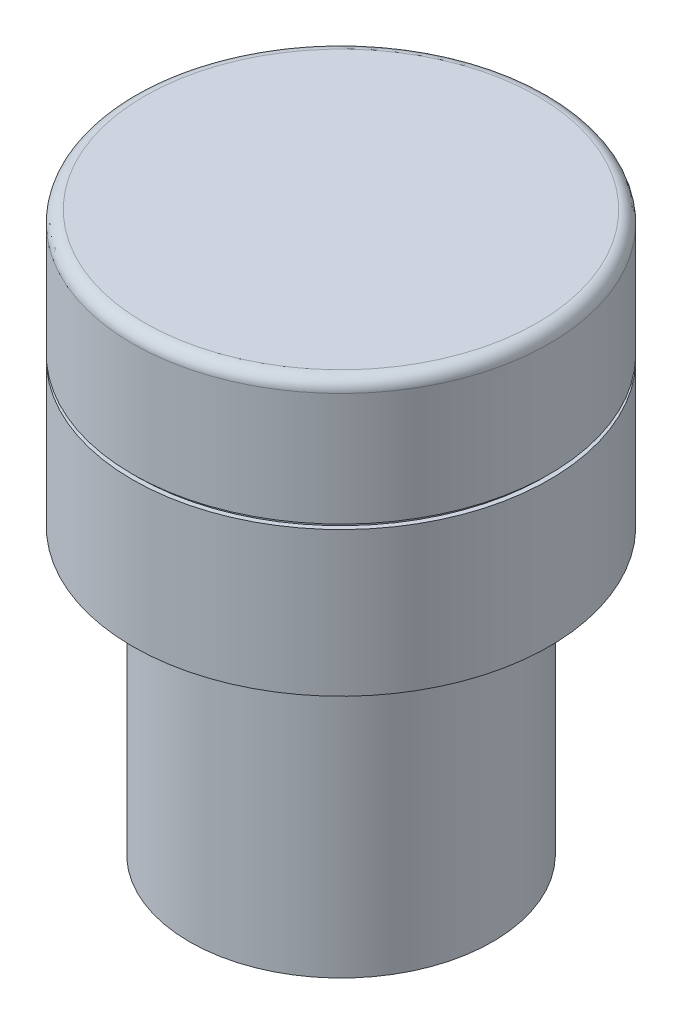
ISO-10303-21;
HEADER;
FILE_DESCRIPTION(('STEP AP214'),'2;1');
FILE_NAME('part.step','',(''),(''),'','','');
FILE_SCHEMA(('AUTOMOTIVE_DESIGN { 1 0 10303 214 1 1 1 1 }'));
ENDSEC;
DATA;
#1=APPLICATION_CONTEXT('core data for automotive mechanical design processes');
#2=APPLICATION_PROTOCOL_DEFINITION('international standard','automotive_design',2000,#1);
#3=PRODUCT_CONTEXT('',#1,'mechanical');
#4=PRODUCT('Part','Part','',(#3));
#5=PRODUCT_RELATED_PRODUCT_CATEGORY('part','',(#4));
#6=PRODUCT_DEFINITION_FORMATION('','',#4);
#7=PRODUCT_DEFINITION_CONTEXT('part definition',#1,'design');
#8=PRODUCT_DEFINITION('design','',#6,#7);
#9=PRODUCT_DEFINITION_SHAPE('','',#8);
#10=(LENGTH_UNIT() NAMED_UNIT(*) SI_UNIT(.MILLI.,.METRE.));
#11=(NAMED_UNIT(*) PLANE_ANGLE_UNIT() SI_UNIT($,.RADIAN.));
#12=(NAMED_UNIT(*) SI_UNIT($,.STERADIAN.) SOLID_ANGLE_UNIT());
#13=UNCERTAINTY_MEASURE_WITH_UNIT(LENGTH_MEASURE(1.E-05),#10,'distance_accuracy_value','');
#14=(GEOMETRIC_REPRESENTATION_CONTEXT(3) GLOBAL_UNCERTAINTY_ASSIGNED_CONTEXT((#13)) GLOBAL_UNIT_ASSIGNED_CONTEXT((#10,
#11,#12)) REPRESENTATION_CONTEXT('',''));
#15=CARTESIAN_POINT('',(0.,0.,0.));
#16=DIRECTION('',(0.,0.,1.));
#17=DIRECTION('',(1.,0.,0.));
#18=AXIS2_PLACEMENT_3D('',#15,#16,#17);
#19=CARTESIAN_POINT('',(0.,22.62,0.));
#20=DIRECTION('',(0.,1.,0.));
#21=DIRECTION('',(0.,0.,1.));
#22=AXIS2_PLACEMENT_3D('',#19,#20,#21);
#23=PLANE('',#22);
#24=CARTESIAN_POINT('',(0.,22.62,0.));
#25=DIRECTION('',(0.,1.,0.));
#26=DIRECTION('',(0.,0.,1.));
#27=AXIS2_PLACEMENT_3D('',#24,#25,#26);
#28=CIRCLE('',#27,11.);
#29=CARTESIAN_POINT('',(0.,22.62,-11.));
#30=VERTEX_POINT('',#29);
#31=EDGE_CURVE('E47',#30,#30,#28,.T.);
#32=ORIENTED_EDGE('',*,*,#31,.T.);
#33=EDGE_LOOP('',(#32));
#34=FACE_BOUND('',#33,.T.);
#35=CARTESIAN_POINT('',(0.,22.62,0.));
#36=DIRECTION('',(0.,1.,0.));
#37=DIRECTION('',(0.,0.,1.));
#38=AXIS2_PLACEMENT_3D('',#35,#36,#37);
#39=CIRCLE('',#38,10.75);
#40=CARTESIAN_POINT('',(0.,22.62,10.75));
#41=VERTEX_POINT('',#40);
#42=EDGE_CURVE('E55',#41,#41,#39,.T.);
#43=ORIENTED_EDGE('',*,*,#42,.F.);
#44=EDGE_LOOP('',(#43));
#45=FACE_BOUND('',#44,.T.);
#46=ADVANCED_FACE('F28',(#34,#45),#23,.T.);
#47=CARTESIAN_POINT('',(0.,15.,0.));
#48=DIRECTION('',(0.,-1.,0.));
#49=DIRECTION('',(0.,0.,-1.));
#50=AXIS2_PLACEMENT_3D('',#47,#48,#49);
#51=CYLINDRICAL_SURFACE('',#50,8.);
#52=CARTESIAN_POINT('',(0.,15.,0.));
#53=DIRECTION('',(0.,1.,0.));
#54=DIRECTION('',(0.,0.,1.));
#55=AXIS2_PLACEMENT_3D('',#52,#53,#54);
#56=CIRCLE('',#55,8.);
#57=CARTESIAN_POINT('',(0.,15.,8.));
#58=VERTEX_POINT('',#57);
#59=EDGE_CURVE('E39',#58,#58,#56,.T.);
#60=ORIENTED_EDGE('',*,*,#59,.F.);
#61=EDGE_LOOP('',(#60));
#62=FACE_BOUND('',#61,.T.);
#63=CARTESIAN_POINT('',(0.,0.,0.));
#64=DIRECTION('',(0.,1.,0.));
#65=DIRECTION('',(0.,0.,1.));
#66=AXIS2_PLACEMENT_3D('',#63,#64,#65);
#67=CIRCLE('',#66,8.);
#68=CARTESIAN_POINT('',(0.,0.,8.));
#69=VERTEX_POINT('',#68);
#70=EDGE_CURVE('E43',#69,#69,#67,.T.);
#71=ORIENTED_EDGE('',*,*,#70,.T.);
#72=EDGE_LOOP('',(#71));
#73=FACE_BOUND('',#72,.T.);
#74=ADVANCED_FACE('F80',(#62,#73),#51,.T.);
#75=CARTESIAN_POINT('',(0.,0.,0.));
#76=DIRECTION('',(0.,1.,0.));
#77=DIRECTION('',(0.,0.,1.));
#78=AXIS2_PLACEMENT_3D('',#75,#76,#77);
#79=PLANE('',#78);
#80=ORIENTED_EDGE('',*,*,#70,.F.);
#81=EDGE_LOOP('',(#80));
#82=FACE_BOUND('',#81,.T.);
#83=ADVANCED_FACE('F86',(#82),#79,.F.);
#84=CARTESIAN_POINT('',(0.,15.,0.));
#85=DIRECTION('',(0.,1.,0.));
#86=DIRECTION('',(0.,0.,1.));
#87=AXIS2_PLACEMENT_3D('',#84,#85,#86);
#88=PLANE('',#87);
#89=CARTESIAN_POINT('',(0.,15.,0.));
#90=DIRECTION('',(0.,1.,0.));
#91=DIRECTION('',(0.,0.,1.));
#92=AXIS2_PLACEMENT_3D('',#89,#90,#91);
#93=CIRCLE('',#92,11.);
#94=CARTESIAN_POINT('',(0.,15.,-11.));
#95=VERTEX_POINT('',#94);
#96=EDGE_CURVE('E49',#95,#95,#93,.T.);
#97=ORIENTED_EDGE('',*,*,#96,.F.);
#98=EDGE_LOOP('',(#97));
#99=FACE_BOUND('',#98,.T.);
#100=ORIENTED_EDGE('',*,*,#59,.T.);
#101=EDGE_LOOP('',(#100));
#102=FACE_BOUND('',#101,.T.);
#103=ADVANCED_FACE('F90',(#99,#102),#88,.F.);
#104=CARTESIAN_POINT('',(0.,22.62,0.));
#105=DIRECTION('',(0.,-1.,0.));
#106=DIRECTION('',(0.,0.,-1.));
#107=AXIS2_PLACEMENT_3D('',#104,#105,#106);
#108=CYLINDRICAL_SURFACE('',#107,11.);
#109=CARTESIAN_POINT('',(0.,22.62,-11.));
#110=CARTESIAN_POINT('',(0.,22.540625,-11.));
#111=CARTESIAN_POINT('',(0.,22.46125,-11.));
#112=CARTESIAN_POINT('',(0.,22.3025,-11.));
#113=CARTESIAN_POINT('',(0.,22.223125,-11.));
#114=CARTESIAN_POINT('',(0.,22.064375,-11.));
#115=CARTESIAN_POINT('',(0.,21.985,-11.));
#116=CARTESIAN_POINT('',(0.,21.82625,-11.));
#117=CARTESIAN_POINT('',(0.,21.746875,-11.));
#118=CARTESIAN_POINT('',(0.,21.588125,-11.));
#119=CARTESIAN_POINT('',(0.,21.50875,-11.));
#120=CARTESIAN_POINT('',(0.,21.35,-11.));
#121=CARTESIAN_POINT('',(0.,21.270625,-11.));
#122=CARTESIAN_POINT('',(0.,21.111875,-11.));
#123=CARTESIAN_POINT('',(0.,21.0325,-11.));
#124=CARTESIAN_POINT('',(0.,20.87375,-11.));
#125=CARTESIAN_POINT('',(0.,20.794375,-11.));
#126=CARTESIAN_POINT('',(0.,20.635625,-11.));
#127=CARTESIAN_POINT('',(0.,20.55625,-11.));
#128=CARTESIAN_POINT('',(0.,20.3975,-11.));
#129=CARTESIAN_POINT('',(0.,20.318125,-11.));
#130=CARTESIAN_POINT('',(0.,20.159375,-11.));
#131=CARTESIAN_POINT('',(0.,20.08,-11.));
#132=CARTESIAN_POINT('',(0.,19.92125,-11.));
#133=CARTESIAN_POINT('',(0.,19.841875,-11.));
#134=CARTESIAN_POINT('',(0.,19.683125,-11.));
#135=CARTESIAN_POINT('',(0.,19.60375,-11.));
#136=CARTESIAN_POINT('',(0.,19.445,-11.));
#137=CARTESIAN_POINT('',(0.,19.365625,-11.));
#138=CARTESIAN_POINT('',(0.,19.206875,-11.));
#139=CARTESIAN_POINT('',(0.,19.1275,-11.));
#140=CARTESIAN_POINT('',(0.,18.96875,-11.));
#141=CARTESIAN_POINT('',(0.,18.889375,-11.));
#142=CARTESIAN_POINT('',(0.,18.730625,-11.));
#143=CARTESIAN_POINT('',(0.,18.65125,-11.));
#144=CARTESIAN_POINT('',(0.,18.4925,-11.));
#145=CARTESIAN_POINT('',(0.,18.413125,-11.));
#146=CARTESIAN_POINT('',(0.,18.254375,-11.));
#147=CARTESIAN_POINT('',(0.,18.175,-11.));
#148=CARTESIAN_POINT('',(0.,18.01625,-11.));
#149=CARTESIAN_POINT('',(0.,17.936875,-11.));
#150=CARTESIAN_POINT('',(0.,17.778125,-11.));
#151=CARTESIAN_POINT('',(0.,17.69875,-11.));
#152=CARTESIAN_POINT('',(0.,17.54,-11.));
#153=CARTESIAN_POINT('',(0.,17.460625,-11.));
#154=CARTESIAN_POINT('',(0.,17.301875,-11.));
#155=CARTESIAN_POINT('',(0.,17.2225,-11.));
#156=CARTESIAN_POINT('',(0.,17.06375,-11.));
#157=CARTESIAN_POINT('',(0.,16.984375,-11.));
#158=CARTESIAN_POINT('',(0.,16.825625,-11.));
#159=CARTESIAN_POINT('',(0.,16.74625,-11.));
#160=CARTESIAN_POINT('',(0.,16.5875,-11.));
#161=CARTESIAN_POINT('',(0.,16.508125,-11.));
#162=CARTESIAN_POINT('',(0.,16.349375,-11.));
#163=CARTESIAN_POINT('',(0.,16.27,-11.));
#164=CARTESIAN_POINT('',(0.,16.11125,-11.));
#165=CARTESIAN_POINT('',(0.,16.031875,-11.));
#166=CARTESIAN_POINT('',(0.,15.873125,-11.));
#167=CARTESIAN_POINT('',(0.,15.79375,-11.));
#168=CARTESIAN_POINT('',(0.,15.635,-11.));
#169=CARTESIAN_POINT('',(0.,15.555625,-11.));
#170=CARTESIAN_POINT('',(0.,15.396875,-11.));
#171=CARTESIAN_POINT('',(0.,15.3175,-11.));
#172=CARTESIAN_POINT('',(0.,15.15875,-11.));
#173=CARTESIAN_POINT('',(0.,15.079375,-11.));
#174=CARTESIAN_POINT('',(0.,15.,-11.));
#175=B_SPLINE_CURVE_WITH_KNOTS('',3,(#109,#110,#111,#112,#113,#114,#115,#116,#117,#118,#119,
#120,#121,#122,#123,#124,#125,#126,#127,#128,#129,#130,#131,#132,#133,#134,#135,#136,#137,#138,
#139,#140,#141,#142,#143,#144,#145,#146,#147,#148,#149,#150,#151,#152,#153,#154,#155,#156,#157,
#158,#159,#160,#161,#162,#163,#164,#165,#166,#167,#168,#169,#170,#171,#172,#173,#174),
.UNSPECIFIED.,.F.,.F.,(4,2,2,2,2,2,2,2,2,2,2,2,2,2,2,2,2,2,2,2,2,2,2,2,2,2,2,2,2,2,2,2,4),(0.,
0.238125000000002,0.476250000000001,0.714375,0.952500000000002,1.190625,1.42875,1.666875,1.905,
2.143125,2.38125,2.619375,2.8575,3.095625,3.33375,3.571875,3.81,4.048125,4.28625,4.524375,
4.7625,5.000625,5.23875,5.476875,5.715,5.953125,6.19125,6.429375,6.6675,6.905625,7.14375,
7.381875,7.62),.UNSPECIFIED.);
#176=EDGE_CURVE('BSEAM75',#30,#95,#175,.T.);
#177=ORIENTED_EDGE('',*,*,#31,.F.);
#178=ORIENTED_EDGE('',*,*,#96,.T.);
#179=ORIENTED_EDGE('',*,*,#176,.T.);
#180=ORIENTED_EDGE('',*,*,#176,.F.);
#181=EDGE_LOOP('',(#177,#179,#178,#180));
#182=FACE_BOUND('',#181,.T.);
#183=ADVANCED_FACE('F75',(#182),#108,.T.);
#184=CARTESIAN_POINT('',(0.,22.87,0.));
#185=DIRECTION('',(0.,-1.,0.));
#186=DIRECTION('',(0.,0.,-1.));
#187=AXIS2_PLACEMENT_3D('',#184,#185,#186);
#188=CYLINDRICAL_SURFACE('',#187,10.75);
#189=CARTESIAN_POINT('',(0.,22.87,0.));
#190=DIRECTION('',(0.,1.,0.));
#191=DIRECTION('',(0.,0.,1.));
#192=AXIS2_PLACEMENT_3D('',#189,#190,#191);
#193=CIRCLE('',#192,10.75);
#194=CARTESIAN_POINT('',(0.,22.87,10.75));
#195=VERTEX_POINT('',#194);
#196=EDGE_CURVE('E52',#195,#195,#193,.T.);
#197=ORIENTED_EDGE('',*,*,#196,.F.);
#198=EDGE_LOOP('',(#197));
#199=FACE_BOUND('',#198,.T.);
#200=ORIENTED_EDGE('',*,*,#42,.T.);
#201=EDGE_LOOP('',(#200));
#202=FACE_BOUND('',#201,.T.);
#203=ADVANCED_FACE('F69',(#199,#202),#188,.T.);
#204=CARTESIAN_POINT('',(0.,22.87,0.));
#205=DIRECTION('',(0.,1.,0.));
#206=DIRECTION('',(0.,0.,1.));
#207=AXIS2_PLACEMENT_3D('',#204,#205,#206);
#208=PLANE('',#207);
#209=CARTESIAN_POINT('',(0.,22.87,0.));
#210=DIRECTION('',(0.,1.,0.));
#211=DIRECTION('',(0.,0.,1.));
#212=AXIS2_PLACEMENT_3D('',#209,#210,#211);
#213=CIRCLE('',#212,11.);
#214=CARTESIAN_POINT('',(0.,22.87,-11.));
#215=VERTEX_POINT('',#214);
#216=EDGE_CURVE('E58',#215,#215,#213,.T.);
#217=ORIENTED_EDGE('',*,*,#216,.F.);
#218=EDGE_LOOP('',(#217));
#219=FACE_BOUND('',#218,.T.);
#220=ORIENTED_EDGE('',*,*,#196,.T.);
#221=EDGE_LOOP('',(#220));
#222=FACE_BOUND('',#221,.T.);
#223=ADVANCED_FACE('F66',(#219,#222),#208,.F.);
#224=CARTESIAN_POINT('',(0.,29.474,0.));
#225=DIRECTION('',(0.,-1.,0.));
#226=DIRECTION('',(0.,0.,-1.));
#227=AXIS2_PLACEMENT_3D('',#224,#225,#226);
#228=CYLINDRICAL_SURFACE('',#227,11.);
#229=CARTESIAN_POINT('',(0.,28.839,0.));
#230=DIRECTION('',(0.,1.,0.));
#231=DIRECTION('',(0.,0.,1.));
#232=AXIS2_PLACEMENT_3D('',#229,#230,#231);
#233=CIRCLE('',#232,11.);
#234=CARTESIAN_POINT('',(0.,28.839,-11.));
#235=VERTEX_POINT('',#234);
#236=EDGE_CURVE('E10',#235,#235,#233,.F.);
#237=CARTESIAN_POINT('',(0.,28.839,-11.));
#238=CARTESIAN_POINT('',(0.,28.7768229166667,-11.));
#239=CARTESIAN_POINT('',(0.,28.7146458333333,-11.));
#240=CARTESIAN_POINT('',(0.,28.5902916666667,-11.));
#241=CARTESIAN_POINT('',(0.,28.5281145833333,-11.));
#242=CARTESIAN_POINT('',(0.,28.4037604166667,-11.));
#243=CARTESIAN_POINT('',(0.,28.3415833333333,-11.));
#244=CARTESIAN_POINT('',(0.,28.2172291666667,-11.));
#245=CARTESIAN_POINT('',(0.,28.1550520833333,-11.));
#246=CARTESIAN_POINT('',(0.,28.0306979166667,-11.));
#247=CARTESIAN_POINT('',(0.,27.9685208333333,-11.));
#248=CARTESIAN_POINT('',(0.,27.8441666666667,-11.));
#249=CARTESIAN_POINT('',(0.,27.7819895833333,-11.));
#250=CARTESIAN_POINT('',(0.,27.6576354166667,-11.));
#251=CARTESIAN_POINT('',(0.,27.5954583333333,-11.));
#252=CARTESIAN_POINT('',(0.,27.4711041666667,-11.));
#253=CARTESIAN_POINT('',(0.,27.4089270833333,-11.));
#254=CARTESIAN_POINT('',(0.,27.2845729166667,-11.));
#255=CARTESIAN_POINT('',(0.,27.2223958333333,-11.));
#256=CARTESIAN_POINT('',(0.,27.0980416666667,-11.));
#257=CARTESIAN_POINT('',(0.,27.0358645833333,-11.));
#258=CARTESIAN_POINT('',(0.,26.9115104166667,-11.));
#259=CARTESIAN_POINT('',(0.,26.8493333333333,-11.));
#260=CARTESIAN_POINT('',(0.,26.7249791666667,-11.));
#261=CARTESIAN_POINT('',(0.,26.6628020833333,-11.));
#262=CARTESIAN_POINT('',(0.,26.5384479166667,-11.));
#263=CARTESIAN_POINT('',(0.,26.4762708333333,-11.));
#264=CARTESIAN_POINT('',(0.,26.3519166666667,-11.));
#265=CARTESIAN_POINT('',(0.,26.2897395833333,-11.));
#266=CARTESIAN_POINT('',(0.,26.1653854166667,-11.));
#267=CARTESIAN_POINT('',(0.,26.1032083333333,-11.));
#268=CARTESIAN_POINT('',(0.,25.9788541666667,-11.));
#269=CARTESIAN_POINT('',(0.,25.9166770833333,-11.));
#270=CARTESIAN_POINT('',(0.,25.7923229166667,-11.));
#271=CARTESIAN_POINT('',(0.,25.7301458333333,-11.));
#272=CARTESIAN_POINT('',(0.,25.6057916666667,-11.));
#273=CARTESIAN_POINT('',(0.,25.5436145833333,-11.));
#274=CARTESIAN_POINT('',(0.,25.4192604166667,-11.));
#275=CARTESIAN_POINT('',(0.,25.3570833333333,-11.));
#276=CARTESIAN_POINT('',(0.,25.2327291666667,-11.));
#277=CARTESIAN_POINT('',(0.,25.1705520833333,-11.));
#278=CARTESIAN_POINT('',(0.,25.0461979166667,-11.));
#279=CARTESIAN_POINT('',(0.,24.9840208333333,-11.));
#280=CARTESIAN_POINT('',(0.,24.8596666666667,-11.));
#281=CARTESIAN_POINT('',(0.,24.7974895833333,-11.));
#282=CARTESIAN_POINT('',(0.,24.6731354166667,-11.));
#283=CARTESIAN_POINT('',(0.,24.6109583333333,-11.));
#284=CARTESIAN_POINT('',(0.,24.4866041666667,-11.));
#285=CARTESIAN_POINT('',(0.,24.4244270833333,-11.));
#286=CARTESIAN_POINT('',(0.,24.3000729166667,-11.));
#287=CARTESIAN_POINT('',(0.,24.2378958333333,-11.));
#288=CARTESIAN_POINT('',(0.,24.1135416666667,-11.));
#289=CARTESIAN_POINT('',(0.,24.0513645833333,-11.));
#290=CARTESIAN_POINT('',(0.,23.9270104166667,-11.));
#291=CARTESIAN_POINT('',(0.,23.8648333333333,-11.));
#292=CARTESIAN_POINT('',(0.,23.7404791666667,-11.));
#293=CARTESIAN_POINT('',(0.,23.6783020833333,-11.));
#294=CARTESIAN_POINT('',(0.,23.5539479166667,-11.));
#295=CARTESIAN_POINT('',(0.,23.4917708333333,-11.));
#296=CARTESIAN_POINT('',(0.,23.3674166666667,-11.));
#297=CARTESIAN_POINT('',(0.,23.3052395833333,-11.));
#298=CARTESIAN_POINT('',(0.,23.1808854166667,-11.));
#299=CARTESIAN_POINT('',(0.,23.1187083333333,-11.));
#300=CARTESIAN_POINT('',(0.,22.9943541666667,-11.));
#301=CARTESIAN_POINT('',(0.,22.9321770833333,-11.));
#302=CARTESIAN_POINT('',(0.,22.87,-11.));
#303=B_SPLINE_CURVE_WITH_KNOTS('',3,(#237,#238,#239,#240,#241,#242,#243,#244,#245,#246,#247,
#248,#249,#250,#251,#252,#253,#254,#255,#256,#257,#258,#259,#260,#261,#262,#263,#264,#265,#266,
#267,#268,#269,#270,#271,#272,#273,#274,#275,#276,#277,#278,#279,#280,#281,#282,#283,#284,#285,
#286,#287,#288,#289,#290,#291,#292,#293,#294,#295,#296,#297,#298,#299,#300,#301,#302),
.UNSPECIFIED.,.F.,.F.,(4,2,2,2,2,2,2,2,2,2,2,2,2,2,2,2,2,2,2,2,2,2,2,2,2,2,2,2,2,2,2,2,4),(0.,
0.18653125,0.373062499999997,0.559593749999997,0.746124999999997,0.932656249999997,1.1191875,
1.30571875,1.49225,1.67878125,1.8653125,2.05184375,2.238375,2.42490625,2.6114375,2.79796875,
2.9845,3.17103125,3.3575625,3.54409375,3.730625,3.91715624999999,4.1036875,4.29021874999999,
4.47675,4.66328124999999,4.8498125,5.03634375,5.22287499999999,5.40940624999999,5.5959375,
5.78246875,5.96899999999999),.UNSPECIFIED.);
#304=EDGE_CURVE('BSEAM64',#235,#215,#303,.T.);
#305=ORIENTED_EDGE('',*,*,#236,.T.);
#306=ORIENTED_EDGE('',*,*,#216,.T.);
#307=ORIENTED_EDGE('',*,*,#304,.T.);
#308=ORIENTED_EDGE('',*,*,#304,.F.);
#309=EDGE_LOOP('',(#305,#307,#306,#308));
#310=FACE_BOUND('',#309,.T.);
#311=ADVANCED_FACE('F64',(#310),#228,.T.);
#312=CARTESIAN_POINT('',(0.,29.474,0.));
#313=DIRECTION('',(0.,1.,0.));
#314=DIRECTION('',(0.,0.,1.));
#315=AXIS2_PLACEMENT_3D('',#312,#313,#314);
#316=PLANE('',#315);
#317=CARTESIAN_POINT('',(0.,29.474,0.));
#318=DIRECTION('',(0.,1.,0.));
#319=DIRECTION('',(0.,0.,1.));
#320=AXIS2_PLACEMENT_3D('',#317,#318,#319);
#321=CIRCLE('',#320,10.365);
#322=CARTESIAN_POINT('',(0.,29.474,10.365));
#323=VERTEX_POINT('',#322);
#324=EDGE_CURVE('E35',#323,#323,#321,.T.);
#325=ORIENTED_EDGE('',*,*,#324,.T.);
#326=EDGE_LOOP('',(#325));
#327=FACE_BOUND('',#326,.T.);
#328=ADVANCED_FACE('F127',(#327),#316,.T.);
#329=CARTESIAN_POINT('',(0.,28.839,0.));
#330=DIRECTION('',(0.,1.,0.));
#331=DIRECTION('',(0.,0.,1.));
#332=AXIS2_PLACEMENT_3D('',#329,#330,#331);
#333=TOROIDAL_SURFACE('',#332,10.365,0.635);
#334=ORIENTED_EDGE('',*,*,#236,.F.);
#335=EDGE_LOOP('',(#334));
#336=FACE_BOUND('',#335,.T.);
#337=ORIENTED_EDGE('',*,*,#324,.F.);
#338=EDGE_LOOP('',(#337));
#339=FACE_BOUND('',#338,.T.);
#340=ADVANCED_FACE('F30',(#336,#339),#333,.T.);
#341=CLOSED_SHELL('',(#46,#74,#83,#103,#183,#203,#223,#311,#328,#340));
#342=MANIFOLD_SOLID_BREP('B2',#341);
#343=ADVANCED_BREP_SHAPE_REPRESENTATION('',(#18,#342),#14);
#344=SHAPE_DEFINITION_REPRESENTATION(#9,#343);
ENDSEC;
END-ISO-10303-21;
